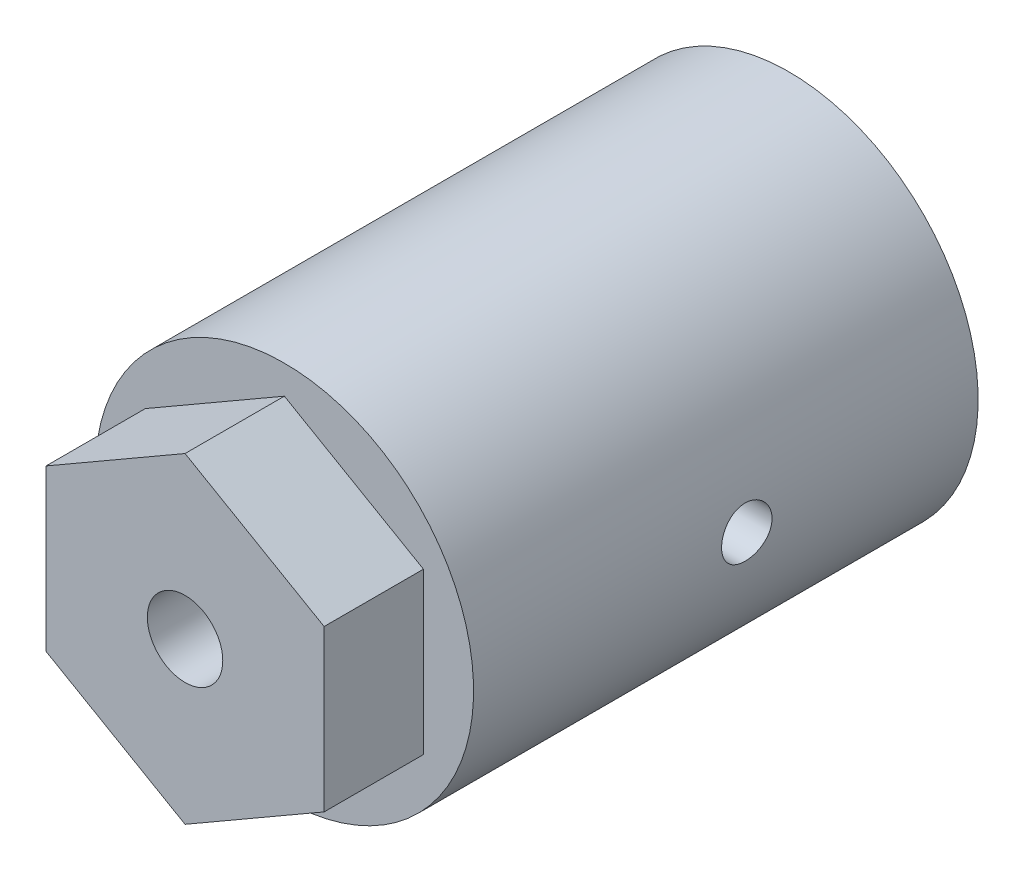
ISO-10303-21;
HEADER;
FILE_DESCRIPTION(('STEP AP214'),'2;1');
FILE_NAME('part.step','',(''),(''),'','','');
FILE_SCHEMA(('AUTOMOTIVE_DESIGN { 1 0 10303 214 1 1 1 1 }'));
ENDSEC;
DATA;
#1=APPLICATION_CONTEXT('core data for automotive mechanical design processes');
#2=APPLICATION_PROTOCOL_DEFINITION('international standard','automotive_design',2000,#1);
#3=PRODUCT_CONTEXT('',#1,'mechanical');
#4=PRODUCT('Part','Part','',(#3));
#5=PRODUCT_RELATED_PRODUCT_CATEGORY('part','',(#4));
#6=PRODUCT_DEFINITION_FORMATION('','',#4);
#7=PRODUCT_DEFINITION_CONTEXT('part definition',#1,'design');
#8=PRODUCT_DEFINITION('design','',#6,#7);
#9=PRODUCT_DEFINITION_SHAPE('','',#8);
#10=(LENGTH_UNIT() NAMED_UNIT(*) SI_UNIT(.MILLI.,.METRE.));
#11=(NAMED_UNIT(*) PLANE_ANGLE_UNIT() SI_UNIT($,.RADIAN.));
#12=(NAMED_UNIT(*) SI_UNIT($,.STERADIAN.) SOLID_ANGLE_UNIT());
#13=UNCERTAINTY_MEASURE_WITH_UNIT(LENGTH_MEASURE(1.E-05),#10,'distance_accuracy_value','');
#14=(GEOMETRIC_REPRESENTATION_CONTEXT(3) GLOBAL_UNCERTAINTY_ASSIGNED_CONTEXT((#13)) GLOBAL_UNIT_ASSIGNED_CONTEXT((#10,
#11,#12)) REPRESENTATION_CONTEXT('',''));
#15=CARTESIAN_POINT('',(0.,0.,0.));
#16=DIRECTION('',(0.,0.,1.));
#17=DIRECTION('',(1.,0.,0.));
#18=AXIS2_PLACEMENT_3D('',#15,#16,#17);
#19=CARTESIAN_POINT('',(7.,4.04145188432738,5.));
#20=DIRECTION('',(-0.5,-0.866025403784439,0.));
#21=DIRECTION('',(0.866025403784439,-0.5,0.));
#22=AXIS2_PLACEMENT_3D('',#19,#20,#21);
#23=PLANE('',#22);
#24=DIRECTION('',(-0.866025403784439,0.5,0.));
#25=VECTOR('',#24,1.);
#26=CARTESIAN_POINT('',(7.,4.04145188432738,0.));
#27=LINE('',#26,#25);
#28=CARTESIAN_POINT('',(7.,4.04145188432738,0.));
#29=VERTEX_POINT('',#28);
#30=CARTESIAN_POINT('',(0.,8.08290376865476,0.));
#31=VERTEX_POINT('',#30);
#32=EDGE_CURVE('E92',#29,#31,#27,.T.);
#33=ORIENTED_EDGE('',*,*,#32,.T.);
#34=DIRECTION('',(0.,0.,-1.));
#35=VECTOR('',#34,1.);
#36=CARTESIAN_POINT('',(0.,8.08290376865476,5.));
#37=LINE('',#36,#35);
#38=CARTESIAN_POINT('',(0.,8.08290376865476,5.));
#39=VERTEX_POINT('',#38);
#40=EDGE_CURVE('E11',#39,#31,#37,.T.);
#41=ORIENTED_EDGE('',*,*,#40,.F.);
#42=DIRECTION('',(-0.866025403784439,0.5,0.));
#43=VECTOR('',#42,1.);
#44=CARTESIAN_POINT('',(7.,4.04145188432738,5.));
#45=LINE('',#44,#43);
#46=CARTESIAN_POINT('',(7.,4.04145188432738,5.));
#47=VERTEX_POINT('',#46);
#48=EDGE_CURVE('E96',#47,#39,#45,.T.);
#49=ORIENTED_EDGE('',*,*,#48,.F.);
#50=DIRECTION('',(0.,0.,-1.));
#51=VECTOR('',#50,1.);
#52=CARTESIAN_POINT('',(7.,4.04145188432738,5.));
#53=LINE('',#52,#51);
#54=EDGE_CURVE('E109',#47,#29,#53,.T.);
#55=ORIENTED_EDGE('',*,*,#54,.T.);
#56=EDGE_LOOP('',(#33,#41,#49,#55));
#57=FACE_BOUND('',#56,.T.);
#58=ADVANCED_FACE('F32',(#57),#23,.F.);
#59=CARTESIAN_POINT('',(0.,8.08290376865476,5.));
#60=DIRECTION('',(0.5,-0.866025403784439,0.));
#61=DIRECTION('',(0.866025403784439,0.5,0.));
#62=AXIS2_PLACEMENT_3D('',#59,#60,#61);
#63=PLANE('',#62);
#64=DIRECTION('',(-0.866025403784439,-0.5,0.));
#65=VECTOR('',#64,1.);
#66=CARTESIAN_POINT('',(0.,8.08290376865476,0.));
#67=LINE('',#66,#65);
#68=CARTESIAN_POINT('',(-7.,4.04145188432738,0.));
#69=VERTEX_POINT('',#68);
#70=EDGE_CURVE('E157',#31,#69,#67,.T.);
#71=ORIENTED_EDGE('',*,*,#70,.T.);
#72=DIRECTION('',(0.,0.,-1.));
#73=VECTOR('',#72,1.);
#74=CARTESIAN_POINT('',(-7.,4.04145188432738,5.));
#75=LINE('',#74,#73);
#76=CARTESIAN_POINT('',(-7.,4.04145188432738,5.));
#77=VERTEX_POINT('',#76);
#78=EDGE_CURVE('E45',#77,#69,#75,.T.);
#79=ORIENTED_EDGE('',*,*,#78,.F.);
#80=DIRECTION('',(-0.866025403784439,-0.5,0.));
#81=VECTOR('',#80,1.);
#82=CARTESIAN_POINT('',(0.,8.08290376865476,5.));
#83=LINE('',#82,#81);
#84=EDGE_CURVE('E147',#39,#77,#83,.T.);
#85=ORIENTED_EDGE('',*,*,#84,.F.);
#86=ORIENTED_EDGE('',*,*,#40,.T.);
#87=EDGE_LOOP('',(#71,#79,#85,#86));
#88=FACE_BOUND('',#87,.T.);
#89=ADVANCED_FACE('F172',(#88),#63,.F.);
#90=CARTESIAN_POINT('',(-7.,4.04145188432738,5.));
#91=DIRECTION('',(1.,0.,0.));
#92=DIRECTION('',(0.,1.,0.));
#93=AXIS2_PLACEMENT_3D('',#90,#91,#92);
#94=PLANE('',#93);
#95=DIRECTION('',(0.,-1.,0.));
#96=VECTOR('',#95,1.);
#97=CARTESIAN_POINT('',(-7.,4.04145188432738,0.));
#98=LINE('',#97,#96);
#99=CARTESIAN_POINT('',(-7.00000000000001,-4.04145188432738,0.));
#100=VERTEX_POINT('',#99);
#101=EDGE_CURVE('E160',#69,#100,#98,.T.);
#102=ORIENTED_EDGE('',*,*,#101,.T.);
#103=DIRECTION('',(0.,0.,-1.));
#104=VECTOR('',#103,1.);
#105=CARTESIAN_POINT('',(-7.00000000000001,-4.04145188432738,5.));
#106=LINE('',#105,#104);
#107=CARTESIAN_POINT('',(-7.00000000000001,-4.04145188432738,5.));
#108=VERTEX_POINT('',#107);
#109=EDGE_CURVE('E111',#108,#100,#106,.T.);
#110=ORIENTED_EDGE('',*,*,#109,.F.);
#111=DIRECTION('',(0.,-1.,0.));
#112=VECTOR('',#111,1.);
#113=CARTESIAN_POINT('',(-7.,4.04145188432738,5.));
#114=LINE('',#113,#112);
#115=EDGE_CURVE('E149',#77,#108,#114,.T.);
#116=ORIENTED_EDGE('',*,*,#115,.F.);
#117=ORIENTED_EDGE('',*,*,#78,.T.);
#118=EDGE_LOOP('',(#102,#110,#116,#117));
#119=FACE_BOUND('',#118,.T.);
#120=ADVANCED_FACE('F168',(#119),#94,.F.);
#121=CARTESIAN_POINT('',(-7.00000000000001,-4.04145188432738,5.));
#122=DIRECTION('',(0.5,0.866025403784438,0.));
#123=DIRECTION('',(-0.866025403784438,0.5,0.));
#124=AXIS2_PLACEMENT_3D('',#121,#122,#123);
#125=PLANE('',#124);
#126=DIRECTION('',(0.866025403784438,-0.5,0.));
#127=VECTOR('',#126,1.);
#128=CARTESIAN_POINT('',(-7.00000000000001,-4.04145188432738,0.));
#129=LINE('',#128,#127);
#130=CARTESIAN_POINT('',(0.,-8.08290376865477,0.));
#131=VERTEX_POINT('',#130);
#132=EDGE_CURVE('E106',#100,#131,#129,.T.);
#133=ORIENTED_EDGE('',*,*,#132,.T.);
#134=DIRECTION('',(0.,0.,-1.));
#135=VECTOR('',#134,1.);
#136=CARTESIAN_POINT('',(0.,-8.08290376865477,5.));
#137=LINE('',#136,#135);
#138=CARTESIAN_POINT('',(0.,-8.08290376865477,5.));
#139=VERTEX_POINT('',#138);
#140=EDGE_CURVE('E105',#139,#131,#137,.T.);
#141=ORIENTED_EDGE('',*,*,#140,.F.);
#142=DIRECTION('',(0.866025403784438,-0.5,0.));
#143=VECTOR('',#142,1.);
#144=CARTESIAN_POINT('',(-7.00000000000001,-4.04145188432738,5.));
#145=LINE('',#144,#143);
#146=EDGE_CURVE('E151',#108,#139,#145,.T.);
#147=ORIENTED_EDGE('',*,*,#146,.F.);
#148=ORIENTED_EDGE('',*,*,#109,.T.);
#149=EDGE_LOOP('',(#133,#141,#147,#148));
#150=FACE_BOUND('',#149,.T.);
#151=ADVANCED_FACE('F164',(#150),#125,.F.);
#152=CARTESIAN_POINT('',(0.,-8.08290376865477,5.));
#153=DIRECTION('',(-0.5,0.866025403784438,0.));
#154=DIRECTION('',(-0.866025403784439,-0.5,0.));
#155=AXIS2_PLACEMENT_3D('',#152,#153,#154);
#156=PLANE('',#155);
#157=DIRECTION('',(0.866025403784439,0.5,0.));
#158=VECTOR('',#157,1.);
#159=CARTESIAN_POINT('',(0.,-8.08290376865477,0.));
#160=LINE('',#159,#158);
#161=CARTESIAN_POINT('',(7.,-4.04145188432738,0.));
#162=VERTEX_POINT('',#161);
#163=EDGE_CURVE('E89',#131,#162,#160,.T.);
#164=ORIENTED_EDGE('',*,*,#163,.T.);
#165=DIRECTION('',(0.,0.,-1.));
#166=VECTOR('',#165,1.);
#167=CARTESIAN_POINT('',(7.,-4.04145188432738,5.));
#168=LINE('',#167,#166);
#169=CARTESIAN_POINT('',(7.,-4.04145188432738,5.));
#170=VERTEX_POINT('',#169);
#171=EDGE_CURVE('E103',#170,#162,#168,.T.);
#172=ORIENTED_EDGE('',*,*,#171,.F.);
#173=DIRECTION('',(0.866025403784439,0.5,0.));
#174=VECTOR('',#173,1.);
#175=CARTESIAN_POINT('',(0.,-8.08290376865477,5.));
#176=LINE('',#175,#174);
#177=EDGE_CURVE('E153',#139,#170,#176,.T.);
#178=ORIENTED_EDGE('',*,*,#177,.F.);
#179=ORIENTED_EDGE('',*,*,#140,.T.);
#180=EDGE_LOOP('',(#164,#172,#178,#179));
#181=FACE_BOUND('',#180,.T.);
#182=ADVANCED_FACE('F101',(#181),#156,.F.);
#183=CARTESIAN_POINT('',(7.,-4.04145188432738,5.));
#184=DIRECTION('',(-1.,0.,0.));
#185=DIRECTION('',(0.,-1.,0.));
#186=AXIS2_PLACEMENT_3D('',#183,#184,#185);
#187=PLANE('',#186);
#188=DIRECTION('',(0.,1.,0.));
#189=VECTOR('',#188,1.);
#190=CARTESIAN_POINT('',(7.,-4.04145188432738,0.));
#191=LINE('',#190,#189);
#192=EDGE_CURVE('E86',#162,#29,#191,.T.);
#193=ORIENTED_EDGE('',*,*,#192,.T.);
#194=ORIENTED_EDGE('',*,*,#54,.F.);
#195=DIRECTION('',(0.,1.,0.));
#196=VECTOR('',#195,1.);
#197=CARTESIAN_POINT('',(7.,-4.04145188432738,5.));
#198=LINE('',#197,#196);
#199=EDGE_CURVE('E53',#170,#47,#198,.T.);
#200=ORIENTED_EDGE('',*,*,#199,.F.);
#201=ORIENTED_EDGE('',*,*,#171,.T.);
#202=EDGE_LOOP('',(#193,#194,#200,#201));
#203=FACE_BOUND('',#202,.T.);
#204=ADVANCED_FACE('F108',(#203),#187,.F.);
#205=CARTESIAN_POINT('',(0.,8.08290376865476,5.));
#206=DIRECTION('',(0.,0.,1.));
#207=DIRECTION('',(1.,0.,0.));
#208=AXIS2_PLACEMENT_3D('',#205,#206,#207);
#209=PLANE('',#208);
#210=CARTESIAN_POINT('',(0.,0.,5.));
#211=DIRECTION('',(0.,0.,1.));
#212=DIRECTION('',(1.,0.,0.));
#213=AXIS2_PLACEMENT_3D('',#210,#211,#212);
#214=CIRCLE('',#213,1.89865);
#215=CARTESIAN_POINT('',(1.89865,0.,5.));
#216=VERTEX_POINT('',#215);
#217=EDGE_CURVE('E121',#216,#216,#214,.T.);
#218=ORIENTED_EDGE('',*,*,#217,.F.);
#219=EDGE_LOOP('',(#218));
#220=FACE_BOUND('',#219,.T.);
#221=ORIENTED_EDGE('',*,*,#48,.T.);
#222=ORIENTED_EDGE('',*,*,#84,.T.);
#223=ORIENTED_EDGE('',*,*,#115,.T.);
#224=ORIENTED_EDGE('',*,*,#146,.T.);
#225=ORIENTED_EDGE('',*,*,#177,.T.);
#226=ORIENTED_EDGE('',*,*,#199,.T.);
#227=EDGE_LOOP('',(#221,#222,#223,#224,#225,#226));
#228=FACE_BOUND('',#227,.T.);
#229=ADVANCED_FACE('F176',(#220,#228),#209,.T.);
#230=CARTESIAN_POINT('',(0.,0.,0.));
#231=DIRECTION('',(0.,0.,-1.));
#232=DIRECTION('',(-1.,0.,0.));
#233=AXIS2_PLACEMENT_3D('',#230,#231,#232);
#234=PLANE('',#233);
#235=CARTESIAN_POINT('',(0.,0.,0.));
#236=DIRECTION('',(0.,0.,-1.));
#237=DIRECTION('',(-1.,0.,0.));
#238=AXIS2_PLACEMENT_3D('',#235,#236,#237);
#239=CIRCLE('',#238,9.525);
#240=CARTESIAN_POINT('',(-9.525,0.,0.));
#241=VERTEX_POINT('',#240);
#242=EDGE_CURVE('E139',#241,#241,#239,.T.);
#243=ORIENTED_EDGE('',*,*,#242,.F.);
#244=EDGE_LOOP('',(#243));
#245=FACE_BOUND('',#244,.T.);
#246=ORIENTED_EDGE('',*,*,#70,.F.);
#247=ORIENTED_EDGE('',*,*,#32,.F.);
#248=ORIENTED_EDGE('',*,*,#192,.F.);
#249=ORIENTED_EDGE('',*,*,#163,.F.);
#250=ORIENTED_EDGE('',*,*,#132,.F.);
#251=ORIENTED_EDGE('',*,*,#101,.F.);
#252=EDGE_LOOP('',(#246,#247,#248,#249,#250,#251));
#253=FACE_BOUND('',#252,.T.);
#254=ADVANCED_FACE('F88',(#245,#253),#234,.F.);
#255=CARTESIAN_POINT('',(0.,0.,-25.4));
#256=DIRECTION('',(0.,0.,1.));
#257=DIRECTION('',(1.,0.,0.));
#258=AXIS2_PLACEMENT_3D('',#255,#256,#257);
#259=CYLINDRICAL_SURFACE('',#258,9.525);
#260=CARTESIAN_POINT('',(9.525,0.,-15.0251407779597));
#261=CARTESIAN_POINT('',(9.52499895696515,-0.0709986106499956,-15.0251377872958));
#262=CARTESIAN_POINT('',(9.52419780911768,-0.142040596840438,-15.0191669913535));
#263=CARTESIAN_POINT('',(9.52107894565584,-0.28214493046268,-14.9954441463132));
#264=CARTESIAN_POINT('',(9.51875968000495,-0.351205179181479,-14.9776800557));
#265=CARTESIAN_POINT('',(9.51286565704157,-0.485297678518135,-14.9309056873209));
#266=CARTESIAN_POINT('',(9.50929177773968,-0.550332708742143,-14.9019032729503));
#267=CARTESIAN_POINT('',(9.50128520529349,-0.67460107334424,-14.8334933876927));
#268=CARTESIAN_POINT('',(9.49685265064689,-0.733835341024011,-14.794087594419));
#269=CARTESIAN_POINT('',(9.48759211691627,-0.845201397290471,-14.705727356841));
#270=CARTESIAN_POINT('',(9.48276207432941,-0.897291820789874,-14.6567209883793));
#271=CARTESIAN_POINT('',(9.47326742349298,-0.992535071524197,-14.550662307896));
#272=CARTESIAN_POINT('',(9.46860282401087,-1.03568742568236,-14.4936095702624));
#273=CARTESIAN_POINT('',(9.4599470150452,-1.11198597940756,-14.3728058348896));
#274=CARTESIAN_POINT('',(9.45595846781259,-1.14509300751437,-14.3090298895858));
#275=CARTESIAN_POINT('',(9.44913392985812,-1.20011091579629,-14.1767610502643));
#276=CARTESIAN_POINT('',(9.44629788950517,-1.22202227810752,-14.1082683595153));
#277=CARTESIAN_POINT('',(9.44211939721104,-1.2539002530033,-13.9689415882911));
#278=CARTESIAN_POINT('',(9.44076817310036,-1.26393704685102,-13.8981238330313));
#279=CARTESIAN_POINT('',(9.43968553771915,-1.27199822148055,-13.7557972539099));
#280=CARTESIAN_POINT('',(9.43995405261954,-1.27002314977337,-13.6842884616948));
#281=CARTESIAN_POINT('',(9.44207252915848,-1.25417418671414,-13.543100860392));
#282=CARTESIAN_POINT('',(9.44391218035188,-1.24037786932669,-13.4734131664823));
#283=CARTESIAN_POINT('',(9.44894956011963,-1.20139920142826,-13.337350886617));
#284=CARTESIAN_POINT('',(9.45214731965871,-1.17621659131025,-13.2709763762403));
#285=CARTESIAN_POINT('',(9.45955220805502,-1.11509765005926,-13.1431851599206));
#286=CARTESIAN_POINT('',(9.46376246768676,-1.07912787675231,-13.0817846372513));
#287=CARTESIAN_POINT('',(9.47271559999658,-0.997479547736237,-12.965861760942));
#288=CARTESIAN_POINT('',(9.47745850036341,-0.951800487190146,-12.9113397651878));
#289=CARTESIAN_POINT('',(9.48698826013327,-0.851601611667402,-12.8102715649702));
#290=CARTESIAN_POINT('',(9.4917751714866,-0.797014983961793,-12.7637915778437));
#291=CARTESIAN_POINT('',(9.50081871624597,-0.680779798034714,-12.6806432794302));
#292=CARTESIAN_POINT('',(9.50507534812444,-0.619131219470905,-12.6439749964073));
#293=CARTESIAN_POINT('',(9.51258190027173,-0.490469059528849,-12.5814898882235));
#294=CARTESIAN_POINT('',(9.51583140777688,-0.423453292564181,-12.5556775107453));
#295=CARTESIAN_POINT('',(9.52095394449085,-0.285985536953518,-12.5156910604123));
#296=CARTESIAN_POINT('',(9.52282704708105,-0.215533731709333,-12.5015163671037));
#297=CARTESIAN_POINT('',(9.52497613274304,-0.0737659836117837,-12.48529417315));
#298=CARTESIAN_POINT('',(9.52526412094144,-0.0024606469373718,-12.4831555128272));
#299=CARTESIAN_POINT('',(9.5242430262696,0.139491476933886,-12.4908250846805));
#300=CARTESIAN_POINT('',(9.5229339822156,0.210138280094497,-12.5006330264915));
#301=CARTESIAN_POINT('',(9.51887336352394,0.348496709388816,-12.5318416328585));
#302=CARTESIAN_POINT('',(9.51612723582355,0.41621838048515,-12.5531985338443));
#303=CARTESIAN_POINT('',(9.50949970876473,0.547119237733911,-12.6068531113297));
#304=CARTESIAN_POINT('',(9.50561826609044,0.61029825045493,-12.6391512052781));
#305=CARTESIAN_POINT('',(9.49712246729997,0.73072553792121,-12.7139897967551));
#306=CARTESIAN_POINT('',(9.49250397054029,0.787937092141844,-12.7565889051877));
#307=CARTESIAN_POINT('',(9.48306287730839,0.894431121339856,-12.8507377920171));
#308=CARTESIAN_POINT('',(9.47824027157794,0.943713236156105,-12.9022879767576));
#309=CARTESIAN_POINT('',(9.46889713070679,1.03327548883667,-13.0132786235358));
#310=CARTESIAN_POINT('',(9.46437876472314,1.07349498031676,-13.0727682328384));
#311=CARTESIAN_POINT('',(9.45619224456154,1.14337052935047,-13.1977120034881));
#312=CARTESIAN_POINT('',(9.45252407139858,1.1730268227907,-13.2631660316028));
#313=CARTESIAN_POINT('',(9.4464683548035,1.22083726177974,-13.3979896266473));
#314=CARTESIAN_POINT('',(9.444077087377,1.23902488317715,-13.4673471480686));
#315=CARTESIAN_POINT('',(9.44083550423415,1.26348913636414,-13.6081659843615));
#316=CARTESIAN_POINT('',(9.43998510609402,1.26976640526007,-13.6796271864957));
#317=CARTESIAN_POINT('',(9.43992416872609,1.2702189848693,-13.8220211946517));
#318=CARTESIAN_POINT('',(9.440700716494,1.26448959188503,-13.892953710972));
#319=CARTESIAN_POINT('',(9.44377831760116,1.24129404196048,-14.0328376286507));
#320=CARTESIAN_POINT('',(9.44607937036908,1.22382788941876,-14.1017890307515));
#321=CARTESIAN_POINT('',(9.45194255323205,1.17768567060952,-14.2357365168245));
#322=CARTESIAN_POINT('',(9.45550409288719,1.14901485220091,-14.3007344360189));
#323=CARTESIAN_POINT('',(9.46348784027642,1.08128652652433,-14.4250123641892));
#324=CARTESIAN_POINT('',(9.46791006462843,1.04222881870322,-14.4842922627298));
#325=CARTESIAN_POINT('',(9.47715889161244,0.954484048035378,-14.5959377056642));
#326=CARTESIAN_POINT('',(9.48198831153842,0.905726072890821,-14.6482472897842));
#327=CARTESIAN_POINT('',(9.49148291566056,0.800113775371381,-14.7439775203493));
#328=CARTESIAN_POINT('',(9.49614806106301,0.743257556363409,-14.7873960786661));
#329=CARTESIAN_POINT('',(9.50481103312331,0.622778147286544,-14.8642744108859));
#330=CARTESIAN_POINT('',(9.50880588981075,0.55912678417242,-14.8976903512223));
#331=CARTESIAN_POINT('',(9.51564848618447,0.427096180087955,-14.9533099580358));
#332=CARTESIAN_POINT('',(9.51849745346938,0.358722091145881,-14.9755256299365));
#333=CARTESIAN_POINT('',(9.52205183306974,0.241673639142497,-15.0028827620143));
#334=CARTESIAN_POINT('',(9.52315191908272,0.193732837041921,-15.0112172875972));
#335=CARTESIAN_POINT('',(9.52462635641639,0.0972014639762315,-15.0223472949548));
#336=CARTESIAN_POINT('',(9.52500071413878,0.0486108987465379,-15.0251428255893));
#337=CARTESIAN_POINT('',(9.525,0.,-15.0251407779597));
#338=B_SPLINE_CURVE_WITH_KNOTS('',3,(#260,#261,#262,#263,#264,#265,#266,#267,#268,#269,#270,
#271,#272,#273,#274,#275,#276,#277,#278,#279,#280,#281,#282,#283,#284,#285,#286,#287,#288,#289,
#290,#291,#292,#293,#294,#295,#296,#297,#298,#299,#300,#301,#302,#303,#304,#305,#306,#307,#308,
#309,#310,#311,#312,#313,#314,#315,#316,#317,#318,#319,#320,#321,#322,#323,#324,#325,#326,#327,
#328,#329,#330,#331,#332,#333,#334,#335,#336,#337),.UNSPECIFIED.,.T.,.F.,(4,2,2,2,2,2,2,2,2,2,2,
2,2,2,2,2,2,2,2,2,2,2,2,2,2,2,2,2,2,2,2,2,2,2,2,2,2,2,4),(0.,0.212818250579147,
0.425854133612003,0.638741224945401,0.85159400778162,1.0656314631166,1.27968024419571,
1.49455328159896,1.7094170648154,1.92300451005618,2.13658221987324,2.34876902037258,
2.56096065896665,2.77381705292565,2.98668451711811,3.2012289574788,3.41577401586208,
3.63040688828612,3.84502831698757,4.05802201469959,4.27101053565094,4.48319755756755,
4.69539267614752,4.90882479478877,5.12226660494314,5.33709692380011,5.55192244498386,
5.76611797457014,5.98030204612608,6.19279258960357,6.40528305344654,6.61767411351165,
6.83006927478399,7.04407829075293,7.25813751094487,7.47312149438318,7.68787454670186,
7.83358694295042,7.97929805385254),.UNSPECIFIED.);
#339=CARTESIAN_POINT('',(9.525,0.,-15.0251407779597));
#340=VERTEX_POINT('',#339);
#341=EDGE_CURVE('E128',#340,#340,#338,.T.);
#342=ORIENTED_EDGE('',*,*,#341,.T.);
#343=EDGE_LOOP('',(#342));
#344=FACE_BOUND('',#343,.T.);
#345=CARTESIAN_POINT('',(0.,0.,-25.4));
#346=DIRECTION('',(0.,0.,-1.));
#347=DIRECTION('',(-1.,0.,0.));
#348=AXIS2_PLACEMENT_3D('',#345,#346,#347);
#349=CIRCLE('',#348,9.525);
#350=CARTESIAN_POINT('',(-9.525,0.,-25.4));
#351=VERTEX_POINT('',#350);
#352=EDGE_CURVE('E141',#351,#351,#349,.T.);
#353=ORIENTED_EDGE('',*,*,#352,.F.);
#354=EDGE_LOOP('',(#353));
#355=FACE_BOUND('',#354,.T.);
#356=ORIENTED_EDGE('',*,*,#242,.T.);
#357=EDGE_LOOP('',(#356));
#358=FACE_BOUND('',#357,.T.);
#359=ADVANCED_FACE('F184',(#344,#355,#358),#259,.T.);
#360=CARTESIAN_POINT('',(0.,0.,-25.4));
#361=DIRECTION('',(0.,0.,-1.));
#362=DIRECTION('',(-1.,0.,0.));
#363=AXIS2_PLACEMENT_3D('',#360,#361,#362);
#364=PLANE('',#363);
#365=CARTESIAN_POINT('',(0.,0.,-25.4));
#366=DIRECTION('',(0.,0.,-1.));
#367=DIRECTION('',(-1.,0.,0.));
#368=AXIS2_PLACEMENT_3D('',#365,#366,#367);
#369=CIRCLE('',#368,3.96875);
#370=CARTESIAN_POINT('',(-3.96875,0.,-25.4));
#371=VERTEX_POINT('',#370);
#372=EDGE_CURVE('E120',#371,#371,#369,.T.);
#373=ORIENTED_EDGE('',*,*,#372,.F.);
#374=EDGE_LOOP('',(#373));
#375=FACE_BOUND('',#374,.T.);
#376=ORIENTED_EDGE('',*,*,#352,.T.);
#377=EDGE_LOOP('',(#376));
#378=FACE_BOUND('',#377,.T.);
#379=ADVANCED_FACE('F222',(#375,#378),#364,.T.);
#380=CARTESIAN_POINT('',(0.,0.,-6.35));
#381=DIRECTION('',(0.,0.,-1.));
#382=DIRECTION('',(-1.,0.,0.));
#383=AXIS2_PLACEMENT_3D('',#380,#381,#382);
#384=CYLINDRICAL_SURFACE('',#383,3.96875);
#385=CARTESIAN_POINT('',(3.96875,0.,-15.0251407779597));
#386=CARTESIAN_POINT('',(3.96874982969003,0.069449796263309,-15.025140584562));
#387=CARTESIAN_POINT('',(3.96690996174107,0.13890199316563,-15.0194253054568));
#388=CARTESIAN_POINT('',(3.95975095599205,0.275770102857252,-14.9967786462083));
#389=CARTESIAN_POINT('',(3.95443118301887,0.343185641552881,-14.9798452184542));
#390=CARTESIAN_POINT('',(3.94089242010606,0.473987197972055,-14.9353954967479));
#391=CARTESIAN_POINT('',(3.93267804748371,0.537379444499023,-14.9078960508905));
#392=CARTESIAN_POINT('',(3.9141947817903,0.658652768013107,-14.8431681690779));
#393=CARTESIAN_POINT('',(3.90392553525931,0.716532894326051,-14.8059380590082));
#394=CARTESIAN_POINT('',(3.88204922672474,0.827003963999766,-14.7215440128659));
#395=CARTESIAN_POINT('',(3.87041197700503,0.879392523220582,-14.6741230181654));
#396=CARTESIAN_POINT('',(3.84728295901812,0.975625300564996,-14.5712403438877));
#397=CARTESIAN_POINT('',(3.83579121994661,1.01946782861326,-14.5157770776336));
#398=CARTESIAN_POINT('',(3.8139275607173,1.09848169839854,-14.3966075746921));
#399=CARTESIAN_POINT('',(3.80359273598112,1.13339660218518,-14.3327238547012));
#400=CARTESIAN_POINT('',(3.78566884627675,1.19190227975581,-14.1996071675922));
#401=CARTESIAN_POINT('',(3.77807901805863,1.21549620195078,-14.1303756939315));
#402=CARTESIAN_POINT('',(3.76682097441224,1.24994300359611,-13.9908189584368));
#403=CARTESIAN_POINT('',(3.76303710602866,1.26117268121819,-13.920596297194));
#404=CARTESIAN_POINT('',(3.75947647141969,1.27174968740463,-13.779169496107));
#405=CARTESIAN_POINT('',(3.75969857999174,1.2711003525564,-13.7079656374772));
#406=CARTESIAN_POINT('',(3.76402297660685,1.25823170959502,-13.5697480949547));
#407=CARTESIAN_POINT('',(3.76796313835396,1.2464958094285,-13.502683468038));
#408=CARTESIAN_POINT('',(3.77901563097891,1.21257265560723,-13.3715302576997));
#409=CARTESIAN_POINT('',(3.78612831395207,1.19038424188779,-13.3074420054764));
#410=CARTESIAN_POINT('',(3.80284556742389,1.13585343344807,-13.1829281025168));
#411=CARTESIAN_POINT('',(3.81248625891306,1.1033622927608,-13.1225726533732));
#412=CARTESIAN_POINT('',(3.83315721858552,1.02925161127666,-13.0080140313072));
#413=CARTESIAN_POINT('',(3.84418786195291,0.987629603565542,-12.953812527032));
#414=CARTESIAN_POINT('',(3.8670418288761,0.89408437785182,-12.8503731938721));
#415=CARTESIAN_POINT('',(3.87887782141493,0.841763431479632,-12.8014971612645));
#416=CARTESIAN_POINT('',(3.90154452191184,0.729520886822363,-12.7131227021117));
#417=CARTESIAN_POINT('',(3.91237514794255,0.669598670049327,-12.6736250394025));
#418=CARTESIAN_POINT('',(3.93193420609764,0.543132629690447,-12.604867294856));
#419=CARTESIAN_POINT('',(3.94064395184929,0.476536765556004,-12.5756972541708));
#420=CARTESIAN_POINT('',(3.95484477873281,0.339039081224147,-12.5290830981087));
#421=CARTESIAN_POINT('',(3.9603368866243,0.268138642610666,-12.5116352418802));
#422=CARTESIAN_POINT('',(3.96731667989813,0.127112545486521,-12.4895857250442));
#423=CARTESIAN_POINT('',(3.9689568526641,0.0570708520260521,-12.4844946070309));
#424=CARTESIAN_POINT('',(3.96850120159015,-0.0828756514855593,-12.4859180324229));
#425=CARTESIAN_POINT('',(3.96640595309588,-0.152780480956905,-12.4924307885494));
#426=CARTESIAN_POINT('',(3.95881526877014,-0.288555920699276,-12.5164860552179));
#427=CARTESIAN_POINT('',(3.95341067527857,-0.354484275216931,-12.5337340815904));
#428=CARTESIAN_POINT('',(3.93983833883805,-0.482490188339213,-12.5784078312305));
#429=CARTESIAN_POINT('',(3.9316702500513,-0.544567263824087,-12.6058348283877));
#430=CARTESIAN_POINT('',(3.91315202747059,-0.664842558322167,-12.6708552728449));
#431=CARTESIAN_POINT('',(3.90275227726922,-0.722904336272645,-12.7086865843139));
#432=CARTESIAN_POINT('',(3.88095655290843,-0.832017880511503,-12.793158539642));
#433=CARTESIAN_POINT('',(3.86956029674071,-0.883067651845968,-12.839801681586));
#434=CARTESIAN_POINT('',(3.84645667781216,-0.97891855181605,-12.9428758921509));
#435=CARTESIAN_POINT('',(3.83475614307903,-1.02337059958777,-12.9996338654373));
#436=CARTESIAN_POINT('',(3.8128610171812,-1.10215475206599,-13.120057175811));
#437=CARTESIAN_POINT('',(3.80266641361083,-1.13648694014093,-13.1837224559892));
#438=CARTESIAN_POINT('',(3.78504658668295,-1.19386016864113,-13.3160728685176));
#439=CARTESIAN_POINT('',(3.7776122760865,-1.21693833881574,-13.3847406226065));
#440=CARTESIAN_POINT('',(3.7664332984111,-1.25111405420383,-13.5252765007479));
#441=CARTESIAN_POINT('',(3.76268713822186,-1.26221644786317,-13.5971433173659));
#442=CARTESIAN_POINT('',(3.75946930297147,-1.27176637403634,-13.7383735784703));
#443=CARTESIAN_POINT('',(3.7598034025407,-1.27078889579551,-13.8076941806681));
#444=CARTESIAN_POINT('',(3.76423363880489,-1.25760444400305,-13.9451304009942));
#445=CARTESIAN_POINT('',(3.76832958365959,-1.24539804308506,-14.0132460803886));
#446=CARTESIAN_POINT('',(3.77968306094785,-1.21049520105357,-14.1452557468647));
#447=CARTESIAN_POINT('',(3.78688859737178,-1.18797092179467,-14.2092000670842));
#448=CARTESIAN_POINT('',(3.80363393135028,-1.13320851815784,-14.3324524252746));
#449=CARTESIAN_POINT('',(3.81317421976223,-1.10096835078499,-14.3917594848455));
#450=CARTESIAN_POINT('',(3.83399898652909,-1.02615417949008,-14.5066709216258));
#451=CARTESIAN_POINT('',(3.84533869497531,-0.983212635675612,-14.5620259615051));
#452=CARTESIAN_POINT('',(3.86823887298121,-0.888852360856064,-14.6649304762048));
#453=CARTESIAN_POINT('',(3.8797994019846,-0.83743131794917,-14.7124778152111));
#454=CARTESIAN_POINT('',(3.90232192133692,-0.725417816924305,-14.8000795424118));
#455=CARTESIAN_POINT('',(3.91324903055016,-0.664568260460116,-14.8398151960179));
#456=CARTESIAN_POINT('',(3.93282318985217,-0.53670480187951,-14.9084438022619));
#457=CARTESIAN_POINT('',(3.9414710276285,-0.469693040171476,-14.9373405021706));
#458=CARTESIAN_POINT('',(3.95500495719592,-0.336282848868095,-14.9816812032001));
#459=CARTESIAN_POINT('',(3.96011321658024,-0.270174058399318,-14.99792979811));
#460=CARTESIAN_POINT('',(3.96698544248484,-0.13604398835417,-15.0196584601398));
#461=CARTESIAN_POINT('',(3.96875016681143,-0.0680231456887323,-15.0251409673845));
#462=CARTESIAN_POINT('',(3.96875,0.,-15.0251407779597));
#463=B_SPLINE_CURVE_WITH_KNOTS('',3,(#385,#386,#387,#388,#389,#390,#391,#392,#393,#394,#395,
#396,#397,#398,#399,#400,#401,#402,#403,#404,#405,#406,#407,#408,#409,#410,#411,#412,#413,#414,
#415,#416,#417,#418,#419,#420,#421,#422,#423,#424,#425,#426,#427,#428,#429,#430,#431,#432,#433,
#434,#435,#436,#437,#438,#439,#440,#441,#442,#443,#444,#445,#446,#447,#448,#449,#450,#451,#452,
#453,#454,#455,#456,#457,#458,#459,#460,#461,#462),.UNSPECIFIED.,.T.,.F.,(4,2,2,2,2,2,2,2,2,2,2,
2,2,2,2,2,2,2,2,2,2,2,2,2,2,2,2,2,2,2,2,2,2,2,2,2,2,2,4),(0.,0.208099255081525,
0.416236504289014,0.624043235426172,0.831885742282331,1.04576338782806,1.25968328730563,
1.47919145381135,1.69863853877114,1.91119513937108,2.12369203780415,2.3273312717271,
2.5309931117303,2.73774055523218,2.94454392526576,3.16124657316845,3.37796686470741,
3.59653261621517,3.81502858457664,4.0247173965688,4.2343739141783,4.43851836757808,
4.64268837810427,4.85198225574971,5.06133555584575,5.27941375735866,5.49749016227117,
5.71484212848364,5.93210606572982,6.13906994631988,6.34602327310056,6.54964259406729,
6.75330476071494,6.96526544356198,7.17728401248866,7.39668864135122,7.61601734701658,
7.81988800112054,8.02371244277129),.UNSPECIFIED.);
#464=CARTESIAN_POINT('',(3.96875,0.,-15.0251407779597));
#465=VERTEX_POINT('',#464);
#466=EDGE_CURVE('E35',#465,#465,#463,.T.);
#467=ORIENTED_EDGE('',*,*,#466,.T.);
#468=EDGE_LOOP('',(#467));
#469=FACE_BOUND('',#468,.T.);
#470=CARTESIAN_POINT('',(0.,0.,-6.35));
#471=DIRECTION('',(0.,0.,-1.));
#472=DIRECTION('',(-1.,0.,0.));
#473=AXIS2_PLACEMENT_3D('',#470,#471,#472);
#474=CIRCLE('',#473,3.96875);
#475=CARTESIAN_POINT('',(-3.96875,0.,-6.35));
#476=VERTEX_POINT('',#475);
#477=EDGE_CURVE('E125',#476,#476,#474,.T.);
#478=ORIENTED_EDGE('',*,*,#477,.F.);
#479=EDGE_LOOP('',(#478));
#480=FACE_BOUND('',#479,.T.);
#481=ORIENTED_EDGE('',*,*,#372,.T.);
#482=EDGE_LOOP('',(#481));
#483=FACE_BOUND('',#482,.T.);
#484=ADVANCED_FACE('F226',(#469,#480,#483),#384,.F.);
#485=CARTESIAN_POINT('',(0.,0.,-6.35));
#486=DIRECTION('',(0.,0.,-1.));
#487=DIRECTION('',(-1.,0.,0.));
#488=AXIS2_PLACEMENT_3D('',#485,#486,#487);
#489=PLANE('',#488);
#490=CARTESIAN_POINT('',(0.,0.,-6.35));
#491=DIRECTION('',(0.,0.,-1.));
#492=DIRECTION('',(-1.,0.,0.));
#493=AXIS2_PLACEMENT_3D('',#490,#491,#492);
#494=CIRCLE('',#493,1.89865);
#495=CARTESIAN_POINT('',(-1.89865,0.,-6.35));
#496=VERTEX_POINT('',#495);
#497=EDGE_CURVE('E118',#496,#496,#494,.T.);
#498=ORIENTED_EDGE('',*,*,#497,.F.);
#499=EDGE_LOOP('',(#498));
#500=FACE_BOUND('',#499,.T.);
#501=ORIENTED_EDGE('',*,*,#477,.T.);
#502=EDGE_LOOP('',(#501));
#503=FACE_BOUND('',#502,.T.);
#504=ADVANCED_FACE('F238',(#500,#503),#489,.T.);
#505=CARTESIAN_POINT('',(0.,0.,5.));
#506=DIRECTION('',(0.,0.,1.));
#507=DIRECTION('',(1.,0.,0.));
#508=AXIS2_PLACEMENT_3D('',#505,#506,#507);
#509=CYLINDRICAL_SURFACE('',#508,1.89865);
#510=ORIENTED_EDGE('',*,*,#497,.T.);
#511=EDGE_LOOP('',(#510));
#512=FACE_BOUND('',#511,.T.);
#513=ORIENTED_EDGE('',*,*,#217,.T.);
#514=EDGE_LOOP('',(#513));
#515=FACE_BOUND('',#514,.T.);
#516=ADVANCED_FACE('F243',(#512,#515),#509,.F.);
#517=CARTESIAN_POINT('',(1.525,0.,-13.7551407779597));
#518=DIRECTION('',(1.,0.,0.));
#519=DIRECTION('',(0.,0.,-1.));
#520=AXIS2_PLACEMENT_3D('',#517,#518,#519);
#521=CYLINDRICAL_SURFACE('',#520,1.27);
#522=ORIENTED_EDGE('',*,*,#466,.F.);
#523=EDGE_LOOP('',(#522));
#524=FACE_BOUND('',#523,.T.);
#525=ORIENTED_EDGE('',*,*,#341,.F.);
#526=EDGE_LOOP('',(#525));
#527=FACE_BOUND('',#526,.T.);
#528=ADVANCED_FACE('F254',(#524,#527),#521,.F.);
#529=CLOSED_SHELL('',(#58,#89,#120,#151,#182,#204,#229,#254,#359,#379,#484,#504,#516,#528));
#530=MANIFOLD_SOLID_BREP('B2',#529);
#531=ADVANCED_BREP_SHAPE_REPRESENTATION('',(#18,#530),#14);
#532=SHAPE_DEFINITION_REPRESENTATION(#9,#531);
ENDSEC;
END-ISO-10303-21;
